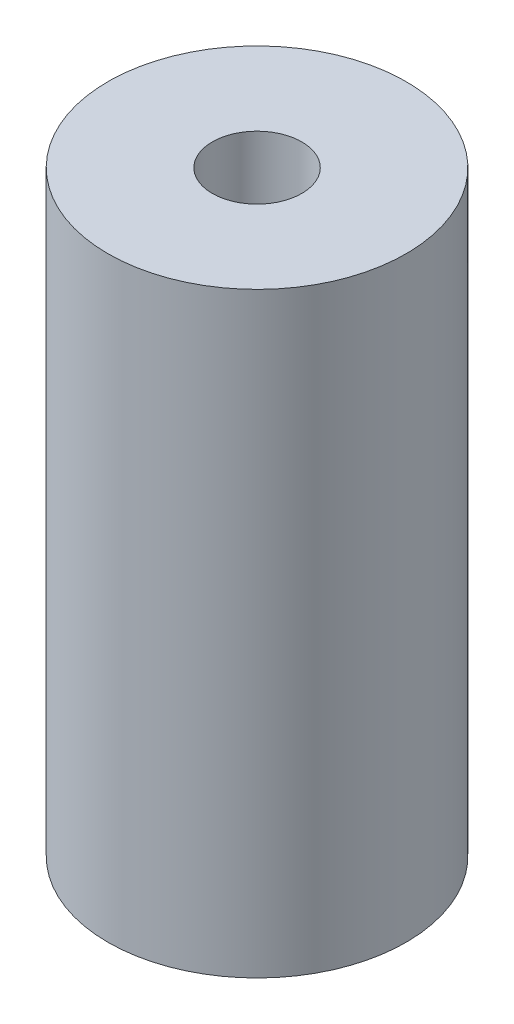
ISO-10303-21;
HEADER;
FILE_DESCRIPTION(('STEP AP214'),'2;1');
FILE_NAME('part.step','',(''),(''),'','','');
FILE_SCHEMA(('AUTOMOTIVE_DESIGN { 1 0 10303 214 1 1 1 1 }'));
ENDSEC;
DATA;
#1=APPLICATION_CONTEXT('core data for automotive mechanical design processes');
#2=APPLICATION_PROTOCOL_DEFINITION('international standard','automotive_design',2000,#1);
#3=PRODUCT_CONTEXT('',#1,'mechanical');
#4=PRODUCT('Part','Part','',(#3));
#5=PRODUCT_RELATED_PRODUCT_CATEGORY('part','',(#4));
#6=PRODUCT_DEFINITION_FORMATION('','',#4);
#7=PRODUCT_DEFINITION_CONTEXT('part definition',#1,'design');
#8=PRODUCT_DEFINITION('design','',#6,#7);
#9=PRODUCT_DEFINITION_SHAPE('','',#8);
#10=(LENGTH_UNIT() NAMED_UNIT(*) SI_UNIT(.MILLI.,.METRE.));
#11=(NAMED_UNIT(*) PLANE_ANGLE_UNIT() SI_UNIT($,.RADIAN.));
#12=(NAMED_UNIT(*) SI_UNIT($,.STERADIAN.) SOLID_ANGLE_UNIT());
#13=UNCERTAINTY_MEASURE_WITH_UNIT(LENGTH_MEASURE(1.E-05),#10,'distance_accuracy_value','');
#14=(GEOMETRIC_REPRESENTATION_CONTEXT(3) GLOBAL_UNCERTAINTY_ASSIGNED_CONTEXT((#13)) GLOBAL_UNIT_ASSIGNED_CONTEXT((#10,
#11,#12)) REPRESENTATION_CONTEXT('',''));
#15=CARTESIAN_POINT('',(0.,0.,0.));
#16=DIRECTION('',(0.,0.,1.));
#17=DIRECTION('',(1.,0.,0.));
#18=AXIS2_PLACEMENT_3D('',#15,#16,#17);
#19=CARTESIAN_POINT('',(0.,20.,0.));
#20=DIRECTION('',(0.,1.,0.));
#21=DIRECTION('',(0.,0.,1.));
#22=AXIS2_PLACEMENT_3D('',#19,#20,#21);
#23=PLANE('',#22);
#24=CARTESIAN_POINT('',(0.,20.,0.));
#25=DIRECTION('',(0.,1.,0.));
#26=DIRECTION('',(0.,0.,1.));
#27=AXIS2_PLACEMENT_3D('',#24,#25,#26);
#28=CIRCLE('',#27,5.);
#29=CARTESIAN_POINT('',(0.,20.,5.));
#30=VERTEX_POINT('',#29);
#31=EDGE_CURVE('E10',#30,#30,#28,.T.);
#32=ORIENTED_EDGE('',*,*,#31,.T.);
#33=EDGE_LOOP('',(#32));
#34=FACE_BOUND('',#33,.T.);
#35=CARTESIAN_POINT('',(0.,20.,0.));
#36=DIRECTION('',(0.,1.,0.));
#37=DIRECTION('',(0.,0.,1.));
#38=AXIS2_PLACEMENT_3D('',#35,#36,#37);
#39=CIRCLE('',#38,1.5);
#40=CARTESIAN_POINT('',(0.,20.,1.5));
#41=VERTEX_POINT('',#40);
#42=EDGE_CURVE('E42',#41,#41,#39,.T.);
#43=ORIENTED_EDGE('',*,*,#42,.F.);
#44=EDGE_LOOP('',(#43));
#45=FACE_BOUND('',#44,.T.);
#46=ADVANCED_FACE('F31',(#34,#45),#23,.T.);
#47=CARTESIAN_POINT('',(0.,0.,0.));
#48=DIRECTION('',(0.,1.,0.));
#49=DIRECTION('',(0.,0.,1.));
#50=AXIS2_PLACEMENT_3D('',#47,#48,#49);
#51=PLANE('',#50);
#52=CARTESIAN_POINT('',(0.,0.,0.));
#53=DIRECTION('',(0.,1.,0.));
#54=DIRECTION('',(0.,0.,1.));
#55=AXIS2_PLACEMENT_3D('',#52,#53,#54);
#56=CIRCLE('',#55,5.);
#57=CARTESIAN_POINT('',(0.,0.,5.));
#58=VERTEX_POINT('',#57);
#59=EDGE_CURVE('E35',#58,#58,#56,.T.);
#60=ORIENTED_EDGE('',*,*,#59,.F.);
#61=EDGE_LOOP('',(#60));
#62=FACE_BOUND('',#61,.T.);
#63=CARTESIAN_POINT('',(0.,0.,0.));
#64=DIRECTION('',(0.,1.,0.));
#65=DIRECTION('',(0.,0.,1.));
#66=AXIS2_PLACEMENT_3D('',#63,#64,#65);
#67=CIRCLE('',#66,1.5);
#68=CARTESIAN_POINT('',(0.,0.,1.5));
#69=VERTEX_POINT('',#68);
#70=EDGE_CURVE('E44',#69,#69,#67,.T.);
#71=ORIENTED_EDGE('',*,*,#70,.T.);
#72=EDGE_LOOP('',(#71));
#73=FACE_BOUND('',#72,.T.);
#74=ADVANCED_FACE('F54',(#62,#73),#51,.F.);
#75=CARTESIAN_POINT('',(0.,20.,0.));
#76=DIRECTION('',(0.,-1.,0.));
#77=DIRECTION('',(0.,0.,-1.));
#78=AXIS2_PLACEMENT_3D('',#75,#76,#77);
#79=CYLINDRICAL_SURFACE('',#78,5.);
#80=ORIENTED_EDGE('',*,*,#31,.F.);
#81=EDGE_LOOP('',(#80));
#82=FACE_BOUND('',#81,.T.);
#83=ORIENTED_EDGE('',*,*,#59,.T.);
#84=EDGE_LOOP('',(#83));
#85=FACE_BOUND('',#84,.T.);
#86=ADVANCED_FACE('F33',(#82,#85),#79,.T.);
#87=CARTESIAN_POINT('',(0.,20.,0.));
#88=DIRECTION('',(0.,-1.,0.));
#89=DIRECTION('',(0.,0.,-1.));
#90=AXIS2_PLACEMENT_3D('',#87,#88,#89);
#91=CYLINDRICAL_SURFACE('',#90,1.5);
#92=ORIENTED_EDGE('',*,*,#42,.T.);
#93=EDGE_LOOP('',(#92));
#94=FACE_BOUND('',#93,.T.);
#95=ORIENTED_EDGE('',*,*,#70,.F.);
#96=EDGE_LOOP('',(#95));
#97=FACE_BOUND('',#96,.T.);
#98=ADVANCED_FACE('F50',(#94,#97),#91,.F.);
#99=CLOSED_SHELL('',(#46,#74,#86,#98));
#100=MANIFOLD_SOLID_BREP('B2',#99);
#101=ADVANCED_BREP_SHAPE_REPRESENTATION('',(#18,#100),#14);
#102=SHAPE_DEFINITION_REPRESENTATION(#9,#101);
ENDSEC;
END-ISO-10303-21;
